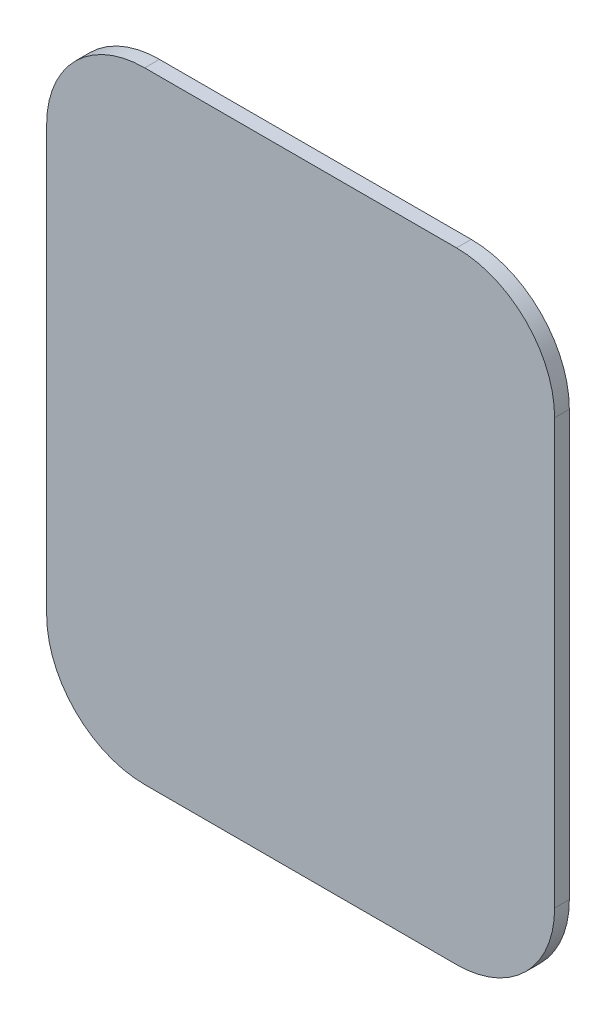
ISO-10303-21;
HEADER;
FILE_DESCRIPTION(('STEP AP214'),'2;1');
FILE_NAME('part.step','',(''),(''),'','','');
FILE_SCHEMA(('AUTOMOTIVE_DESIGN { 1 0 10303 214 1 1 1 1 }'));
ENDSEC;
DATA;
#1=APPLICATION_CONTEXT('core data for automotive mechanical design processes');
#2=APPLICATION_PROTOCOL_DEFINITION('international standard','automotive_design',2000,#1);
#3=PRODUCT_CONTEXT('',#1,'mechanical');
#4=PRODUCT('Part','Part','',(#3));
#5=PRODUCT_RELATED_PRODUCT_CATEGORY('part','',(#4));
#6=PRODUCT_DEFINITION_FORMATION('','',#4);
#7=PRODUCT_DEFINITION_CONTEXT('part definition',#1,'design');
#8=PRODUCT_DEFINITION('design','',#6,#7);
#9=PRODUCT_DEFINITION_SHAPE('','',#8);
#10=(LENGTH_UNIT() NAMED_UNIT(*) SI_UNIT(.MILLI.,.METRE.));
#11=(NAMED_UNIT(*) PLANE_ANGLE_UNIT() SI_UNIT($,.RADIAN.));
#12=(NAMED_UNIT(*) SI_UNIT($,.STERADIAN.) SOLID_ANGLE_UNIT());
#13=UNCERTAINTY_MEASURE_WITH_UNIT(LENGTH_MEASURE(1.E-05),#10,'distance_accuracy_value','');
#14=(GEOMETRIC_REPRESENTATION_CONTEXT(3) GLOBAL_UNCERTAINTY_ASSIGNED_CONTEXT((#13)) GLOBAL_UNIT_ASSIGNED_CONTEXT((#10,
#11,#12)) REPRESENTATION_CONTEXT('',''));
#15=CARTESIAN_POINT('',(0.,0.,0.));
#16=DIRECTION('',(0.,0.,1.));
#17=DIRECTION('',(1.,0.,0.));
#18=AXIS2_PLACEMENT_3D('',#15,#16,#17);
#19=CARTESIAN_POINT('',(51.8,63.3,3.));
#20=DIRECTION('',(-1.,0.,0.));
#21=DIRECTION('',(0.,-1.,0.));
#22=AXIS2_PLACEMENT_3D('',#19,#20,#21);
#23=PLANE('',#22);
#24=DIRECTION('',(0.,1.,0.));
#25=VECTOR('',#24,1.);
#26=CARTESIAN_POINT('',(51.8,63.3,3.));
#27=LINE('',#26,#25);
#28=CARTESIAN_POINT('',(51.8,-43.3,3.));
#29=VERTEX_POINT('',#28);
#30=CARTESIAN_POINT('',(51.8,43.3,3.));
#31=VERTEX_POINT('',#30);
#32=EDGE_CURVE('E140',#29,#31,#27,.T.);
#33=ORIENTED_EDGE('',*,*,#32,.F.);
#34=DIRECTION('',(0.,0.,-1.));
#35=VECTOR('',#34,1.);
#36=CARTESIAN_POINT('',(51.8,-43.3,3.));
#37=LINE('',#36,#35);
#38=CARTESIAN_POINT('',(51.8,-43.3,0.));
#39=VERTEX_POINT('',#38);
#40=EDGE_CURVE('E11',#29,#39,#37,.T.);
#41=ORIENTED_EDGE('',*,*,#40,.T.);
#42=DIRECTION('',(0.,1.,0.));
#43=VECTOR('',#42,1.);
#44=CARTESIAN_POINT('',(51.8,63.3,0.));
#45=LINE('',#44,#43);
#46=CARTESIAN_POINT('',(51.8,43.3,0.));
#47=VERTEX_POINT('',#46);
#48=EDGE_CURVE('E142',#39,#47,#45,.T.);
#49=ORIENTED_EDGE('',*,*,#48,.T.);
#50=DIRECTION('',(0.,0.,-1.));
#51=VECTOR('',#50,1.);
#52=CARTESIAN_POINT('',(51.8,43.3,3.));
#53=LINE('',#52,#51);
#54=EDGE_CURVE('E48',#47,#31,#53,.F.);
#55=ORIENTED_EDGE('',*,*,#54,.T.);
#56=EDGE_LOOP('',(#33,#41,#49,#55));
#57=FACE_BOUND('',#56,.T.);
#58=ADVANCED_FACE('F39',(#57),#23,.F.);
#59=CARTESIAN_POINT('',(-51.8,63.3,3.));
#60=DIRECTION('',(0.,-1.,0.));
#61=DIRECTION('',(0.,0.,-1.));
#62=AXIS2_PLACEMENT_3D('',#59,#60,#61);
#63=PLANE('',#62);
#64=DIRECTION('',(-1.,0.,0.));
#65=VECTOR('',#64,1.);
#66=CARTESIAN_POINT('',(-51.8,63.3,0.));
#67=LINE('',#66,#65);
#68=CARTESIAN_POINT('',(31.7999999999999,63.3,0.));
#69=VERTEX_POINT('',#68);
#70=CARTESIAN_POINT('',(-31.8,63.3,0.));
#71=VERTEX_POINT('',#70);
#72=EDGE_CURVE('E136',#69,#71,#67,.T.);
#73=ORIENTED_EDGE('',*,*,#72,.T.);
#74=DIRECTION('',(0.,0.,-1.));
#75=VECTOR('',#74,1.);
#76=CARTESIAN_POINT('',(-31.8,63.3,3.));
#77=LINE('',#76,#75);
#78=CARTESIAN_POINT('',(-31.8,63.3,3.));
#79=VERTEX_POINT('',#78);
#80=EDGE_CURVE('E112',#71,#79,#77,.F.);
#81=ORIENTED_EDGE('',*,*,#80,.T.);
#82=DIRECTION('',(-1.,0.,0.));
#83=VECTOR('',#82,1.);
#84=CARTESIAN_POINT('',(-51.8,63.3,3.));
#85=LINE('',#84,#83);
#86=CARTESIAN_POINT('',(31.7999999999999,63.3,3.));
#87=VERTEX_POINT('',#86);
#88=EDGE_CURVE('E192',#87,#79,#85,.T.);
#89=ORIENTED_EDGE('',*,*,#88,.F.);
#90=DIRECTION('',(0.,0.,-1.));
#91=VECTOR('',#90,1.);
#92=CARTESIAN_POINT('',(31.8,63.3,3.));
#93=LINE('',#92,#91);
#94=EDGE_CURVE('E118',#87,#69,#93,.T.);
#95=ORIENTED_EDGE('',*,*,#94,.T.);
#96=EDGE_LOOP('',(#73,#81,#89,#95));
#97=FACE_BOUND('',#96,.T.);
#98=ADVANCED_FACE('F196',(#97),#63,.F.);
#99=CARTESIAN_POINT('',(-51.8,63.3,3.));
#100=DIRECTION('',(1.,0.,0.));
#101=DIRECTION('',(0.,1.,0.));
#102=AXIS2_PLACEMENT_3D('',#99,#100,#101);
#103=PLANE('',#102);
#104=DIRECTION('',(0.,-1.,0.));
#105=VECTOR('',#104,1.);
#106=CARTESIAN_POINT('',(-51.8,63.3,3.));
#107=LINE('',#106,#105);
#108=CARTESIAN_POINT('',(-51.8,43.3,3.));
#109=VERTEX_POINT('',#108);
#110=CARTESIAN_POINT('',(-51.8,-43.3,3.));
#111=VERTEX_POINT('',#110);
#112=EDGE_CURVE('E127',#109,#111,#107,.T.);
#113=ORIENTED_EDGE('',*,*,#112,.F.);
#114=DIRECTION('',(0.,0.,-1.));
#115=VECTOR('',#114,1.);
#116=CARTESIAN_POINT('',(-51.8,43.3,3.));
#117=LINE('',#116,#115);
#118=CARTESIAN_POINT('',(-51.8,43.3,0.));
#119=VERTEX_POINT('',#118);
#120=EDGE_CURVE('E111',#109,#119,#117,.T.);
#121=ORIENTED_EDGE('',*,*,#120,.T.);
#122=DIRECTION('',(0.,-1.,0.));
#123=VECTOR('',#122,1.);
#124=CARTESIAN_POINT('',(-51.8,63.3,0.));
#125=LINE('',#124,#123);
#126=CARTESIAN_POINT('',(-51.8,-43.3,0.));
#127=VERTEX_POINT('',#126);
#128=EDGE_CURVE('E125',#119,#127,#125,.T.);
#129=ORIENTED_EDGE('',*,*,#128,.T.);
#130=DIRECTION('',(0.,0.,-1.));
#131=VECTOR('',#130,1.);
#132=CARTESIAN_POINT('',(-51.8,-43.3,3.));
#133=LINE('',#132,#131);
#134=EDGE_CURVE('E130',#127,#111,#133,.F.);
#135=ORIENTED_EDGE('',*,*,#134,.T.);
#136=EDGE_LOOP('',(#113,#121,#129,#135));
#137=FACE_BOUND('',#136,.T.);
#138=ADVANCED_FACE('F124',(#137),#103,.F.);
#139=CARTESIAN_POINT('',(-51.8,-63.3,3.));
#140=DIRECTION('',(0.,1.,0.));
#141=DIRECTION('',(0.,0.,1.));
#142=AXIS2_PLACEMENT_3D('',#139,#140,#141);
#143=PLANE('',#142);
#144=DIRECTION('',(1.,0.,0.));
#145=VECTOR('',#144,1.);
#146=CARTESIAN_POINT('',(-51.8,-63.3,3.));
#147=LINE('',#146,#145);
#148=CARTESIAN_POINT('',(-31.8,-63.3,3.));
#149=VERTEX_POINT('',#148);
#150=CARTESIAN_POINT('',(31.8,-63.3,3.));
#151=VERTEX_POINT('',#150);
#152=EDGE_CURVE('E147',#149,#151,#147,.T.);
#153=ORIENTED_EDGE('',*,*,#152,.F.);
#154=DIRECTION('',(0.,0.,-1.));
#155=VECTOR('',#154,1.);
#156=CARTESIAN_POINT('',(-31.8,-63.3,3.));
#157=LINE('',#156,#155);
#158=CARTESIAN_POINT('',(-31.8,-63.3,0.));
#159=VERTEX_POINT('',#158);
#160=EDGE_CURVE('E174',#149,#159,#157,.T.);
#161=ORIENTED_EDGE('',*,*,#160,.T.);
#162=DIRECTION('',(1.,0.,0.));
#163=VECTOR('',#162,1.);
#164=CARTESIAN_POINT('',(-51.8,-63.3,0.));
#165=LINE('',#164,#163);
#166=CARTESIAN_POINT('',(31.8,-63.3,0.));
#167=VERTEX_POINT('',#166);
#168=EDGE_CURVE('E135',#159,#167,#165,.T.);
#169=ORIENTED_EDGE('',*,*,#168,.T.);
#170=DIRECTION('',(0.,0.,-1.));
#171=VECTOR('',#170,1.);
#172=CARTESIAN_POINT('',(31.8,-63.3,3.));
#173=LINE('',#172,#171);
#174=EDGE_CURVE('E55',#167,#151,#173,.F.);
#175=ORIENTED_EDGE('',*,*,#174,.T.);
#176=EDGE_LOOP('',(#153,#161,#169,#175));
#177=FACE_BOUND('',#176,.T.);
#178=ADVANCED_FACE('F207',(#177),#143,.F.);
#179=CARTESIAN_POINT('',(0.,0.,3.));
#180=DIRECTION('',(0.,0.,1.));
#181=DIRECTION('',(1.,0.,0.));
#182=AXIS2_PLACEMENT_3D('',#179,#180,#181);
#183=PLANE('',#182);
#184=ORIENTED_EDGE('',*,*,#88,.T.);
#185=CARTESIAN_POINT('',(-31.8,43.3,3.));
#186=DIRECTION('',(0.,0.,1.));
#187=DIRECTION('',(1.,0.,0.));
#188=AXIS2_PLACEMENT_3D('',#185,#186,#187);
#189=CIRCLE('',#188,20.);
#190=EDGE_CURVE('E169',#79,#109,#189,.T.);
#191=ORIENTED_EDGE('',*,*,#190,.T.);
#192=ORIENTED_EDGE('',*,*,#112,.T.);
#193=CARTESIAN_POINT('',(-31.8,-43.3,3.));
#194=DIRECTION('',(0.,0.,1.));
#195=DIRECTION('',(1.,0.,0.));
#196=AXIS2_PLACEMENT_3D('',#193,#194,#195);
#197=CIRCLE('',#196,20.);
#198=EDGE_CURVE('E62',#111,#149,#197,.T.);
#199=ORIENTED_EDGE('',*,*,#198,.T.);
#200=ORIENTED_EDGE('',*,*,#152,.T.);
#201=CARTESIAN_POINT('',(31.8,-43.3,3.));
#202=DIRECTION('',(0.,0.,1.));
#203=DIRECTION('',(1.,0.,0.));
#204=AXIS2_PLACEMENT_3D('',#201,#202,#203);
#205=CIRCLE('',#204,20.);
#206=EDGE_CURVE('E164',#151,#29,#205,.T.);
#207=ORIENTED_EDGE('',*,*,#206,.T.);
#208=ORIENTED_EDGE('',*,*,#32,.T.);
#209=CARTESIAN_POINT('',(31.8,43.3,3.));
#210=DIRECTION('',(0.,0.,1.));
#211=DIRECTION('',(1.,0.,0.));
#212=AXIS2_PLACEMENT_3D('',#209,#210,#211);
#213=CIRCLE('',#212,20.);
#214=EDGE_CURVE('E161',#31,#87,#213,.T.);
#215=ORIENTED_EDGE('',*,*,#214,.T.);
#216=EDGE_LOOP('',(#184,#191,#192,#199,#200,#207,#208,#215));
#217=FACE_BOUND('',#216,.T.);
#218=ADVANCED_FACE('F188',(#217),#183,.T.);
#219=CARTESIAN_POINT('',(0.,0.,0.));
#220=DIRECTION('',(0.,0.,1.));
#221=DIRECTION('',(1.,0.,0.));
#222=AXIS2_PLACEMENT_3D('',#219,#220,#221);
#223=PLANE('',#222);
#224=ORIENTED_EDGE('',*,*,#128,.F.);
#225=CARTESIAN_POINT('',(-31.8,43.3,0.));
#226=DIRECTION('',(0.,0.,1.));
#227=DIRECTION('',(1.,0.,0.));
#228=AXIS2_PLACEMENT_3D('',#225,#226,#227);
#229=CIRCLE('',#228,20.);
#230=EDGE_CURVE('E107',#119,#71,#229,.F.);
#231=ORIENTED_EDGE('',*,*,#230,.T.);
#232=ORIENTED_EDGE('',*,*,#72,.F.);
#233=CARTESIAN_POINT('',(31.8,43.3,0.));
#234=DIRECTION('',(0.,0.,1.));
#235=DIRECTION('',(1.,0.,0.));
#236=AXIS2_PLACEMENT_3D('',#233,#234,#235);
#237=CIRCLE('',#236,20.);
#238=EDGE_CURVE('E129',#69,#47,#237,.F.);
#239=ORIENTED_EDGE('',*,*,#238,.T.);
#240=ORIENTED_EDGE('',*,*,#48,.F.);
#241=CARTESIAN_POINT('',(31.8,-43.3,0.));
#242=DIRECTION('',(0.,0.,1.));
#243=DIRECTION('',(1.,0.,0.));
#244=AXIS2_PLACEMENT_3D('',#241,#242,#243);
#245=CIRCLE('',#244,20.);
#246=EDGE_CURVE('E151',#39,#167,#245,.F.);
#247=ORIENTED_EDGE('',*,*,#246,.T.);
#248=ORIENTED_EDGE('',*,*,#168,.F.);
#249=CARTESIAN_POINT('',(-31.8,-43.3,0.));
#250=DIRECTION('',(0.,0.,1.));
#251=DIRECTION('',(1.,0.,0.));
#252=AXIS2_PLACEMENT_3D('',#249,#250,#251);
#253=CIRCLE('',#252,20.);
#254=EDGE_CURVE('E119',#159,#127,#253,.F.);
#255=ORIENTED_EDGE('',*,*,#254,.T.);
#256=EDGE_LOOP('',(#224,#231,#232,#239,#240,#247,#248,#255));
#257=FACE_BOUND('',#256,.T.);
#258=ADVANCED_FACE('F132',(#257),#223,.F.);
#259=CARTESIAN_POINT('',(-31.8,43.3,3.));
#260=DIRECTION('',(0.,0.,-1.));
#261=DIRECTION('',(-1.,0.,0.));
#262=AXIS2_PLACEMENT_3D('',#259,#260,#261);
#263=CYLINDRICAL_SURFACE('',#262,20.);
#264=ORIENTED_EDGE('',*,*,#190,.F.);
#265=ORIENTED_EDGE('',*,*,#80,.F.);
#266=ORIENTED_EDGE('',*,*,#230,.F.);
#267=ORIENTED_EDGE('',*,*,#120,.F.);
#268=EDGE_LOOP('',(#264,#265,#266,#267));
#269=FACE_BOUND('',#268,.T.);
#270=ADVANCED_FACE('F110',(#269),#263,.T.);
#271=CARTESIAN_POINT('',(-31.8,-43.3,3.));
#272=DIRECTION('',(0.,0.,-1.));
#273=DIRECTION('',(-1.,0.,0.));
#274=AXIS2_PLACEMENT_3D('',#271,#272,#273);
#275=CYLINDRICAL_SURFACE('',#274,20.);
#276=ORIENTED_EDGE('',*,*,#198,.F.);
#277=ORIENTED_EDGE('',*,*,#134,.F.);
#278=ORIENTED_EDGE('',*,*,#254,.F.);
#279=ORIENTED_EDGE('',*,*,#160,.F.);
#280=EDGE_LOOP('',(#276,#277,#278,#279));
#281=FACE_BOUND('',#280,.T.);
#282=ADVANCED_FACE('F206',(#281),#275,.T.);
#283=CARTESIAN_POINT('',(31.8,-43.3,3.));
#284=DIRECTION('',(0.,0.,-1.));
#285=DIRECTION('',(-1.,0.,0.));
#286=AXIS2_PLACEMENT_3D('',#283,#284,#285);
#287=CYLINDRICAL_SURFACE('',#286,20.);
#288=ORIENTED_EDGE('',*,*,#206,.F.);
#289=ORIENTED_EDGE('',*,*,#174,.F.);
#290=ORIENTED_EDGE('',*,*,#246,.F.);
#291=ORIENTED_EDGE('',*,*,#40,.F.);
#292=EDGE_LOOP('',(#288,#289,#290,#291));
#293=FACE_BOUND('',#292,.T.);
#294=ADVANCED_FACE('F209',(#293),#287,.T.);
#295=CARTESIAN_POINT('',(31.8,43.3,3.));
#296=DIRECTION('',(0.,0.,-1.));
#297=DIRECTION('',(-1.,0.,0.));
#298=AXIS2_PLACEMENT_3D('',#295,#296,#297);
#299=CYLINDRICAL_SURFACE('',#298,20.);
#300=ORIENTED_EDGE('',*,*,#214,.F.);
#301=ORIENTED_EDGE('',*,*,#54,.F.);
#302=ORIENTED_EDGE('',*,*,#238,.F.);
#303=ORIENTED_EDGE('',*,*,#94,.F.);
#304=EDGE_LOOP('',(#300,#301,#302,#303));
#305=FACE_BOUND('',#304,.T.);
#306=ADVANCED_FACE('F41',(#305),#299,.T.);
#307=CLOSED_SHELL('',(#58,#98,#138,#178,#218,#258,#270,#282,#294,#306));
#308=MANIFOLD_SOLID_BREP('B2',#307);
#309=ADVANCED_BREP_SHAPE_REPRESENTATION('',(#18,#308),#14);
#310=SHAPE_DEFINITION_REPRESENTATION(#9,#309);
ENDSEC;
END-ISO-10303-21;
